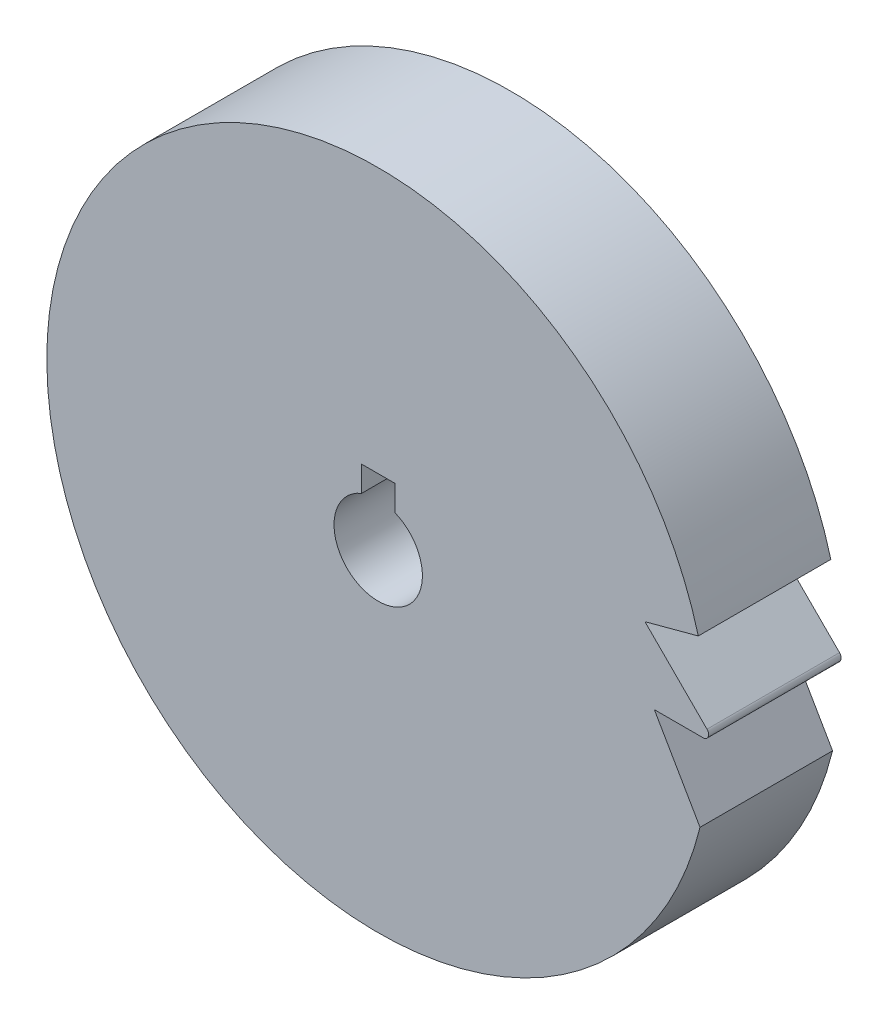
ISO-10303-21;
HEADER;
FILE_DESCRIPTION(('STEP AP214'),'2;1');
FILE_NAME('part.step','',(''),(''),'','','');
FILE_SCHEMA(('AUTOMOTIVE_DESIGN { 1 0 10303 214 1 1 1 1 }'));
ENDSEC;
DATA;
#1=APPLICATION_CONTEXT('core data for automotive mechanical design processes');
#2=APPLICATION_PROTOCOL_DEFINITION('international standard','automotive_design',2000,#1);
#3=PRODUCT_CONTEXT('',#1,'mechanical');
#4=PRODUCT('Part','Part','',(#3));
#5=PRODUCT_RELATED_PRODUCT_CATEGORY('part','',(#4));
#6=PRODUCT_DEFINITION_FORMATION('','',#4);
#7=PRODUCT_DEFINITION_CONTEXT('part definition',#1,'design');
#8=PRODUCT_DEFINITION('design','',#6,#7);
#9=PRODUCT_DEFINITION_SHAPE('','',#8);
#10=(LENGTH_UNIT() NAMED_UNIT(*) SI_UNIT(.MILLI.,.METRE.));
#11=(NAMED_UNIT(*) PLANE_ANGLE_UNIT() SI_UNIT($,.RADIAN.));
#12=(NAMED_UNIT(*) SI_UNIT($,.STERADIAN.) SOLID_ANGLE_UNIT());
#13=UNCERTAINTY_MEASURE_WITH_UNIT(LENGTH_MEASURE(1.E-05),#10,'distance_accuracy_value','');
#14=(GEOMETRIC_REPRESENTATION_CONTEXT(3) GLOBAL_UNCERTAINTY_ASSIGNED_CONTEXT((#13)) GLOBAL_UNIT_ASSIGNED_CONTEXT((#10,
#11,#12)) REPRESENTATION_CONTEXT('',''));
#15=CARTESIAN_POINT('',(0.,0.,0.));
#16=DIRECTION('',(0.,0.,1.));
#17=DIRECTION('',(1.,0.,0.));
#18=AXIS2_PLACEMENT_3D('',#15,#16,#17);
#19=CARTESIAN_POINT('',(0.,0.,12.));
#20=DIRECTION('',(0.,0.,1.));
#21=DIRECTION('',(1.,0.,0.));
#22=AXIS2_PLACEMENT_3D('',#19,#20,#21);
#23=PLANE('',#22);
#24=DIRECTION('',(-0.965925826289068,-0.258819045102522,0.));
#25=VECTOR('',#24,1.);
#26=CARTESIAN_POINT('',(24.1481456572267,6.47047612756304,12.));
#27=LINE('',#26,#25);
#28=CARTESIAN_POINT('',(28.977774788672,7.76457135307565,12.));
#29=VERTEX_POINT('',#28);
#30=CARTESIAN_POINT('',(24.1481456572267,6.47047612756304,12.));
#31=VERTEX_POINT('',#30);
#32=EDGE_CURVE('E133',#29,#31,#27,.T.);
#33=ORIENTED_EDGE('',*,*,#32,.F.);
#34=CARTESIAN_POINT('',(0.,0.,12.));
#35=DIRECTION('',(0.,0.,1.));
#36=DIRECTION('',(1.,0.,0.));
#37=AXIS2_PLACEMENT_3D('',#34,#35,#36);
#38=CIRCLE('',#37,30.);
#39=CARTESIAN_POINT('',(29.1332798286476,-7.15905066511723,12.));
#40=VERTEX_POINT('',#39);
#41=EDGE_CURVE('E184',#29,#40,#38,.T.);
#42=ORIENTED_EDGE('',*,*,#41,.T.);
#43=DIRECTION('',(0.499999999999999,-0.866025403784439,0.));
#44=VECTOR('',#43,1.);
#45=CARTESIAN_POINT('',(25.,0.,12.));
#46=LINE('',#45,#44);
#47=CARTESIAN_POINT('',(25.,0.,12.));
#48=VERTEX_POINT('',#47);
#49=EDGE_CURVE('E45',#48,#40,#46,.T.);
#50=ORIENTED_EDGE('',*,*,#49,.F.);
#51=DIRECTION('',(-1.,0.,0.));
#52=VECTOR('',#51,1.);
#53=CARTESIAN_POINT('',(25.,0.,12.));
#54=LINE('',#53,#52);
#55=CARTESIAN_POINT('',(29.4115150036032,0.,12.));
#56=VERTEX_POINT('',#55);
#57=EDGE_CURVE('E145',#56,#48,#54,.T.);
#58=ORIENTED_EDGE('',*,*,#57,.F.);
#59=CARTESIAN_POINT('',(29.4115150036032,0.499999999999999,12.));
#60=DIRECTION('',(0.,0.,-1.));
#61=DIRECTION('',(1.,0.,0.));
#62=AXIS2_PLACEMENT_3D('',#59,#60,#61);
#63=CIRCLE('',#62,0.5);
#64=CARTESIAN_POINT('',(29.7650683941964,0.853553390593281,12.));
#65=VERTEX_POINT('',#64);
#66=EDGE_CURVE('E143',#65,#56,#63,.T.);
#67=ORIENTED_EDGE('',*,*,#66,.F.);
#68=DIRECTION('',(0.707106781186547,-0.707106781186548,0.));
#69=VECTOR('',#68,1.);
#70=CARTESIAN_POINT('',(24.1481456572267,6.47047612756304,12.));
#71=LINE('',#70,#69);
#72=EDGE_CURVE('E115',#31,#65,#71,.T.);
#73=ORIENTED_EDGE('',*,*,#72,.F.);
#74=EDGE_LOOP('',(#33,#42,#50,#58,#67,#73));
#75=FACE_BOUND('',#74,.T.);
#76=DIRECTION('',(-1.,0.,0.));
#77=VECTOR('',#76,1.);
#78=CARTESIAN_POINT('',(-1.5,6.,12.));
#79=LINE('',#78,#77);
#80=CARTESIAN_POINT('',(1.5,6.,12.));
#81=VERTEX_POINT('',#80);
#82=CARTESIAN_POINT('',(-1.5,6.,12.));
#83=VERTEX_POINT('',#82);
#84=EDGE_CURVE('E157',#81,#83,#79,.T.);
#85=ORIENTED_EDGE('',*,*,#84,.F.);
#86=DIRECTION('',(0.,1.,0.));
#87=VECTOR('',#86,1.);
#88=CARTESIAN_POINT('',(1.5,6.,12.));
#89=LINE('',#88,#87);
#90=CARTESIAN_POINT('',(1.5,3.70809924354783,12.));
#91=VERTEX_POINT('',#90);
#92=EDGE_CURVE('E155',#91,#81,#89,.T.);
#93=ORIENTED_EDGE('',*,*,#92,.F.);
#94=CARTESIAN_POINT('',(0.,0.,12.));
#95=DIRECTION('',(0.,0.,1.));
#96=DIRECTION('',(1.,0.,0.));
#97=AXIS2_PLACEMENT_3D('',#94,#95,#96);
#98=CIRCLE('',#97,4.);
#99=CARTESIAN_POINT('',(-1.5,3.70809924354783,12.));
#100=VERTEX_POINT('',#99);
#101=EDGE_CURVE('E162',#100,#91,#98,.T.);
#102=ORIENTED_EDGE('',*,*,#101,.F.);
#103=DIRECTION('',(0.,-1.,0.));
#104=VECTOR('',#103,1.);
#105=CARTESIAN_POINT('',(-1.5,6.,12.));
#106=LINE('',#105,#104);
#107=EDGE_CURVE('E160',#83,#100,#106,.T.);
#108=ORIENTED_EDGE('',*,*,#107,.F.);
#109=EDGE_LOOP('',(#85,#93,#102,#108));
#110=FACE_BOUND('',#109,.T.);
#111=ADVANCED_FACE('F30',(#75,#110),#23,.T.);
#112=CARTESIAN_POINT('',(0.,0.,0.));
#113=DIRECTION('',(0.,0.,1.));
#114=DIRECTION('',(1.,0.,0.));
#115=AXIS2_PLACEMENT_3D('',#112,#113,#114);
#116=PLANE('',#115);
#117=CARTESIAN_POINT('',(0.,0.,0.));
#118=DIRECTION('',(0.,0.,1.));
#119=DIRECTION('',(1.,0.,0.));
#120=AXIS2_PLACEMENT_3D('',#117,#118,#119);
#121=CIRCLE('',#120,30.);
#122=CARTESIAN_POINT('',(28.977774788672,7.76457135307565,0.));
#123=VERTEX_POINT('',#122);
#124=CARTESIAN_POINT('',(29.1332798286476,-7.15905066511723,0.));
#125=VERTEX_POINT('',#124);
#126=EDGE_CURVE('E183',#123,#125,#121,.T.);
#127=ORIENTED_EDGE('',*,*,#126,.F.);
#128=DIRECTION('',(-0.965925826289068,-0.258819045102522,0.));
#129=VECTOR('',#128,1.);
#130=CARTESIAN_POINT('',(24.1481456572267,6.47047612756304,0.));
#131=LINE('',#130,#129);
#132=CARTESIAN_POINT('',(24.1481456572267,6.47047612756304,0.));
#133=VERTEX_POINT('',#132);
#134=EDGE_CURVE('E120',#123,#133,#131,.T.);
#135=ORIENTED_EDGE('',*,*,#134,.T.);
#136=DIRECTION('',(0.707106781186547,-0.707106781186548,0.));
#137=VECTOR('',#136,1.);
#138=CARTESIAN_POINT('',(24.1481456572267,6.47047612756304,0.));
#139=LINE('',#138,#137);
#140=CARTESIAN_POINT('',(29.7650683941964,0.853553390593281,0.));
#141=VERTEX_POINT('',#140);
#142=EDGE_CURVE('E112',#133,#141,#139,.T.);
#143=ORIENTED_EDGE('',*,*,#142,.T.);
#144=CARTESIAN_POINT('',(29.4115150036032,0.499999999999999,0.));
#145=DIRECTION('',(0.,0.,-1.));
#146=DIRECTION('',(1.,0.,0.));
#147=AXIS2_PLACEMENT_3D('',#144,#145,#146);
#148=CIRCLE('',#147,0.5);
#149=CARTESIAN_POINT('',(29.4115150036032,0.,0.));
#150=VERTEX_POINT('',#149);
#151=EDGE_CURVE('E123',#141,#150,#148,.T.);
#152=ORIENTED_EDGE('',*,*,#151,.T.);
#153=DIRECTION('',(-1.,0.,0.));
#154=VECTOR('',#153,1.);
#155=CARTESIAN_POINT('',(25.,0.,0.));
#156=LINE('',#155,#154);
#157=CARTESIAN_POINT('',(25.,0.,0.));
#158=VERTEX_POINT('',#157);
#159=EDGE_CURVE('E128',#150,#158,#156,.T.);
#160=ORIENTED_EDGE('',*,*,#159,.T.);
#161=DIRECTION('',(0.499999999999999,-0.866025403784439,0.));
#162=VECTOR('',#161,1.);
#163=CARTESIAN_POINT('',(25.,0.,0.));
#164=LINE('',#163,#162);
#165=EDGE_CURVE('E138',#158,#125,#164,.T.);
#166=ORIENTED_EDGE('',*,*,#165,.T.);
#167=EDGE_LOOP('',(#127,#135,#143,#152,#160,#166));
#168=FACE_BOUND('',#167,.T.);
#169=DIRECTION('',(0.,1.,0.));
#170=VECTOR('',#169,1.);
#171=CARTESIAN_POINT('',(1.5,6.,0.));
#172=LINE('',#171,#170);
#173=CARTESIAN_POINT('',(1.5,3.70809924354783,0.));
#174=VERTEX_POINT('',#173);
#175=CARTESIAN_POINT('',(1.5,6.,0.));
#176=VERTEX_POINT('',#175);
#177=EDGE_CURVE('E151',#174,#176,#172,.T.);
#178=ORIENTED_EDGE('',*,*,#177,.T.);
#179=DIRECTION('',(-1.,0.,0.));
#180=VECTOR('',#179,1.);
#181=CARTESIAN_POINT('',(-1.5,6.,0.));
#182=LINE('',#181,#180);
#183=CARTESIAN_POINT('',(-1.5,6.,0.));
#184=VERTEX_POINT('',#183);
#185=EDGE_CURVE('E167',#176,#184,#182,.T.);
#186=ORIENTED_EDGE('',*,*,#185,.T.);
#187=DIRECTION('',(0.,-1.,0.));
#188=VECTOR('',#187,1.);
#189=CARTESIAN_POINT('',(-1.5,6.,0.));
#190=LINE('',#189,#188);
#191=CARTESIAN_POINT('',(-1.5,3.70809924354783,0.));
#192=VERTEX_POINT('',#191);
#193=EDGE_CURVE('E170',#184,#192,#190,.T.);
#194=ORIENTED_EDGE('',*,*,#193,.T.);
#195=CARTESIAN_POINT('',(0.,0.,0.));
#196=DIRECTION('',(0.,0.,1.));
#197=DIRECTION('',(1.,0.,0.));
#198=AXIS2_PLACEMENT_3D('',#195,#196,#197);
#199=CIRCLE('',#198,4.);
#200=EDGE_CURVE('E158',#192,#174,#199,.T.);
#201=ORIENTED_EDGE('',*,*,#200,.T.);
#202=EDGE_LOOP('',(#178,#186,#194,#201));
#203=FACE_BOUND('',#202,.T.);
#204=ADVANCED_FACE('F131',(#168,#203),#116,.F.);
#205=CARTESIAN_POINT('',(0.,0.,12.));
#206=DIRECTION('',(0.,0.,-1.));
#207=DIRECTION('',(-1.,0.,0.));
#208=AXIS2_PLACEMENT_3D('',#205,#206,#207);
#209=CYLINDRICAL_SURFACE('',#208,30.);
#210=ORIENTED_EDGE('',*,*,#41,.F.);
#211=DIRECTION('',(0.,0.,-1.));
#212=VECTOR('',#211,1.);
#213=CARTESIAN_POINT('',(28.977774788672,7.76457135307564,12.));
#214=LINE('',#213,#212);
#215=EDGE_CURVE('E11',#29,#123,#214,.T.);
#216=ORIENTED_EDGE('',*,*,#215,.T.);
#217=ORIENTED_EDGE('',*,*,#126,.T.);
#218=DIRECTION('',(0.,0.,-1.));
#219=VECTOR('',#218,1.);
#220=CARTESIAN_POINT('',(29.1332798286476,-7.15905066511724,12.));
#221=LINE('',#220,#219);
#222=EDGE_CURVE('E38',#125,#40,#221,.F.);
#223=ORIENTED_EDGE('',*,*,#222,.T.);
#224=EDGE_LOOP('',(#210,#216,#217,#223));
#225=FACE_BOUND('',#224,.T.);
#226=ADVANCED_FACE('F32',(#225),#209,.T.);
#227=CARTESIAN_POINT('',(1.5,6.,12.));
#228=DIRECTION('',(-1.,0.,0.));
#229=DIRECTION('',(0.,-1.,0.));
#230=AXIS2_PLACEMENT_3D('',#227,#228,#229);
#231=PLANE('',#230);
#232=ORIENTED_EDGE('',*,*,#177,.F.);
#233=DIRECTION('',(0.,0.,-1.));
#234=VECTOR('',#233,1.);
#235=CARTESIAN_POINT('',(1.5,3.70809924354783,12.));
#236=LINE('',#235,#234);
#237=EDGE_CURVE('E164',#91,#174,#236,.T.);
#238=ORIENTED_EDGE('',*,*,#237,.F.);
#239=ORIENTED_EDGE('',*,*,#92,.T.);
#240=DIRECTION('',(0.,0.,-1.));
#241=VECTOR('',#240,1.);
#242=CARTESIAN_POINT('',(1.5,6.,12.));
#243=LINE('',#242,#241);
#244=EDGE_CURVE('E180',#81,#176,#243,.T.);
#245=ORIENTED_EDGE('',*,*,#244,.T.);
#246=EDGE_LOOP('',(#232,#238,#239,#245));
#247=FACE_BOUND('',#246,.T.);
#248=ADVANCED_FACE('F215',(#247),#231,.T.);
#249=CARTESIAN_POINT('',(-1.5,6.,12.));
#250=DIRECTION('',(0.,-1.,0.));
#251=DIRECTION('',(1.,0.,0.));
#252=AXIS2_PLACEMENT_3D('',#249,#250,#251);
#253=PLANE('',#252);
#254=ORIENTED_EDGE('',*,*,#185,.F.);
#255=ORIENTED_EDGE('',*,*,#244,.F.);
#256=ORIENTED_EDGE('',*,*,#84,.T.);
#257=DIRECTION('',(0.,0.,-1.));
#258=VECTOR('',#257,1.);
#259=CARTESIAN_POINT('',(-1.5,6.,12.));
#260=LINE('',#259,#258);
#261=EDGE_CURVE('E178',#83,#184,#260,.T.);
#262=ORIENTED_EDGE('',*,*,#261,.T.);
#263=EDGE_LOOP('',(#254,#255,#256,#262));
#264=FACE_BOUND('',#263,.T.);
#265=ADVANCED_FACE('F218',(#264),#253,.T.);
#266=CARTESIAN_POINT('',(-1.5,6.,12.));
#267=DIRECTION('',(1.,0.,0.));
#268=DIRECTION('',(0.,1.,0.));
#269=AXIS2_PLACEMENT_3D('',#266,#267,#268);
#270=PLANE('',#269);
#271=ORIENTED_EDGE('',*,*,#193,.F.);
#272=ORIENTED_EDGE('',*,*,#261,.F.);
#273=ORIENTED_EDGE('',*,*,#107,.T.);
#274=DIRECTION('',(0.,0.,-1.));
#275=VECTOR('',#274,1.);
#276=CARTESIAN_POINT('',(-1.5,3.70809924354783,12.));
#277=LINE('',#276,#275);
#278=EDGE_CURVE('E53',#100,#192,#277,.T.);
#279=ORIENTED_EDGE('',*,*,#278,.T.);
#280=EDGE_LOOP('',(#271,#272,#273,#279));
#281=FACE_BOUND('',#280,.T.);
#282=ADVANCED_FACE('F222',(#281),#270,.T.);
#283=CARTESIAN_POINT('',(0.,0.,12.));
#284=DIRECTION('',(0.,0.,-1.));
#285=DIRECTION('',(-1.,0.,0.));
#286=AXIS2_PLACEMENT_3D('',#283,#284,#285);
#287=CYLINDRICAL_SURFACE('',#286,4.);
#288=ORIENTED_EDGE('',*,*,#200,.F.);
#289=ORIENTED_EDGE('',*,*,#278,.F.);
#290=ORIENTED_EDGE('',*,*,#101,.T.);
#291=ORIENTED_EDGE('',*,*,#237,.T.);
#292=EDGE_LOOP('',(#288,#289,#290,#291));
#293=FACE_BOUND('',#292,.T.);
#294=ADVANCED_FACE('F226',(#293),#287,.F.);
#295=CARTESIAN_POINT('',(24.1481456572267,6.47047612756304,0.));
#296=DIRECTION('',(-0.258819045102522,0.965925826289068,0.));
#297=DIRECTION('',(-0.965925826289068,-0.258819045102522,0.));
#298=AXIS2_PLACEMENT_3D('',#295,#296,#297);
#299=PLANE('',#298);
#300=ORIENTED_EDGE('',*,*,#32,.T.);
#301=DIRECTION('',(0.,0.,1.));
#302=VECTOR('',#301,1.);
#303=CARTESIAN_POINT('',(24.1481456572267,6.47047612756304,0.));
#304=LINE('',#303,#302);
#305=EDGE_CURVE('E149',#133,#31,#304,.T.);
#306=ORIENTED_EDGE('',*,*,#305,.F.);
#307=ORIENTED_EDGE('',*,*,#134,.F.);
#308=ORIENTED_EDGE('',*,*,#215,.F.);
#309=EDGE_LOOP('',(#300,#306,#307,#308));
#310=FACE_BOUND('',#309,.T.);
#311=ADVANCED_FACE('F196',(#310),#299,.F.);
#312=CARTESIAN_POINT('',(25.,0.,0.));
#313=DIRECTION('',(-0.866025403784439,-0.499999999999999,0.));
#314=DIRECTION('',(0.499999999999999,-0.866025403784439,0.));
#315=AXIS2_PLACEMENT_3D('',#312,#313,#314);
#316=PLANE('',#315);
#317=ORIENTED_EDGE('',*,*,#165,.F.);
#318=DIRECTION('',(0.,0.,1.));
#319=VECTOR('',#318,1.);
#320=CARTESIAN_POINT('',(25.,0.,0.));
#321=LINE('',#320,#319);
#322=EDGE_CURVE('E152',#158,#48,#321,.T.);
#323=ORIENTED_EDGE('',*,*,#322,.T.);
#324=ORIENTED_EDGE('',*,*,#49,.T.);
#325=ORIENTED_EDGE('',*,*,#222,.F.);
#326=EDGE_LOOP('',(#317,#323,#324,#325));
#327=FACE_BOUND('',#326,.T.);
#328=ADVANCED_FACE('F197',(#327),#316,.F.);
#329=CARTESIAN_POINT('',(24.1481456572267,6.47047612756304,0.));
#330=DIRECTION('',(-0.707106781186548,-0.707106781186547,0.));
#331=DIRECTION('',(0.707106781186547,-0.707106781186548,0.));
#332=AXIS2_PLACEMENT_3D('',#329,#330,#331);
#333=PLANE('',#332);
#334=ORIENTED_EDGE('',*,*,#72,.T.);
#335=DIRECTION('',(0.,0.,1.));
#336=VECTOR('',#335,1.);
#337=CARTESIAN_POINT('',(29.7650683941964,0.853553390593281,0.));
#338=LINE('',#337,#336);
#339=EDGE_CURVE('E107',#141,#65,#338,.T.);
#340=ORIENTED_EDGE('',*,*,#339,.F.);
#341=ORIENTED_EDGE('',*,*,#142,.F.);
#342=ORIENTED_EDGE('',*,*,#305,.T.);
#343=EDGE_LOOP('',(#334,#340,#341,#342));
#344=FACE_BOUND('',#343,.T.);
#345=ADVANCED_FACE('F109',(#344),#333,.F.);
#346=CARTESIAN_POINT('',(25.,0.,0.));
#347=DIRECTION('',(0.,1.,0.));
#348=DIRECTION('',(-1.,0.,0.));
#349=AXIS2_PLACEMENT_3D('',#346,#347,#348);
#350=PLANE('',#349);
#351=ORIENTED_EDGE('',*,*,#57,.T.);
#352=ORIENTED_EDGE('',*,*,#322,.F.);
#353=ORIENTED_EDGE('',*,*,#159,.F.);
#354=DIRECTION('',(0.,0.,1.));
#355=VECTOR('',#354,1.);
#356=CARTESIAN_POINT('',(29.4115150036032,0.,0.));
#357=LINE('',#356,#355);
#358=EDGE_CURVE('E119',#150,#56,#357,.T.);
#359=ORIENTED_EDGE('',*,*,#358,.T.);
#360=EDGE_LOOP('',(#351,#352,#353,#359));
#361=FACE_BOUND('',#360,.T.);
#362=ADVANCED_FACE('F199',(#361),#350,.F.);
#363=CARTESIAN_POINT('',(29.4115150036032,0.499999999999999,0.));
#364=DIRECTION('',(0.,0.,1.));
#365=DIRECTION('',(1.,0.,0.));
#366=AXIS2_PLACEMENT_3D('',#363,#364,#365);
#367=CYLINDRICAL_SURFACE('',#366,0.5);
#368=ORIENTED_EDGE('',*,*,#66,.T.);
#369=ORIENTED_EDGE('',*,*,#358,.F.);
#370=ORIENTED_EDGE('',*,*,#151,.F.);
#371=ORIENTED_EDGE('',*,*,#339,.T.);
#372=EDGE_LOOP('',(#368,#369,#370,#371));
#373=FACE_BOUND('',#372,.T.);
#374=ADVANCED_FACE('F124',(#373),#367,.T.);
#375=CLOSED_SHELL('',(#111,#204,#226,#248,#265,#282,#294,#311,#328,#345,#362,#374));
#376=MANIFOLD_SOLID_BREP('B2',#375);
#377=ADVANCED_BREP_SHAPE_REPRESENTATION('',(#18,#376),#14);
#378=SHAPE_DEFINITION_REPRESENTATION(#9,#377);
ENDSEC;
END-ISO-10303-21;
